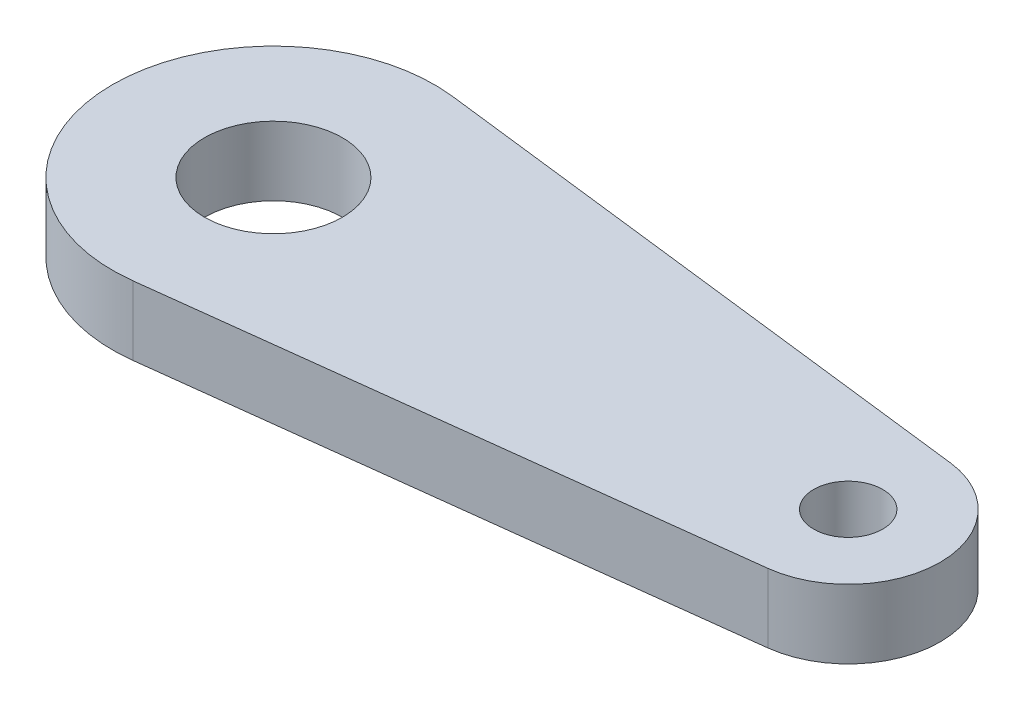
ISO-10303-21;
HEADER;
FILE_DESCRIPTION(('STEP AP214'),'2;1');
FILE_NAME('part.step','',(''),(''),'','','');
FILE_SCHEMA(('AUTOMOTIVE_DESIGN { 1 0 10303 214 1 1 1 1 }'));
ENDSEC;
DATA;
#1=APPLICATION_CONTEXT('core data for automotive mechanical design processes');
#2=APPLICATION_PROTOCOL_DEFINITION('international standard','automotive_design',2000,#1);
#3=PRODUCT_CONTEXT('',#1,'mechanical');
#4=PRODUCT('Part','Part','',(#3));
#5=PRODUCT_RELATED_PRODUCT_CATEGORY('part','',(#4));
#6=PRODUCT_DEFINITION_FORMATION('','',#4);
#7=PRODUCT_DEFINITION_CONTEXT('part definition',#1,'design');
#8=PRODUCT_DEFINITION('design','',#6,#7);
#9=PRODUCT_DEFINITION_SHAPE('','',#8);
#10=(LENGTH_UNIT() NAMED_UNIT(*) SI_UNIT(.MILLI.,.METRE.));
#11=(NAMED_UNIT(*) PLANE_ANGLE_UNIT() SI_UNIT($,.RADIAN.));
#12=(NAMED_UNIT(*) SI_UNIT($,.STERADIAN.) SOLID_ANGLE_UNIT());
#13=UNCERTAINTY_MEASURE_WITH_UNIT(LENGTH_MEASURE(1.E-05),#10,'distance_accuracy_value','');
#14=(GEOMETRIC_REPRESENTATION_CONTEXT(3) GLOBAL_UNCERTAINTY_ASSIGNED_CONTEXT((#13)) GLOBAL_UNIT_ASSIGNED_CONTEXT((#10,
#11,#12)) REPRESENTATION_CONTEXT('',''));
#15=CARTESIAN_POINT('',(0.,0.,0.));
#16=DIRECTION('',(0.,0.,1.));
#17=DIRECTION('',(1.,0.,0.));
#18=AXIS2_PLACEMENT_3D('',#15,#16,#17);
#19=CARTESIAN_POINT('',(25.,3.,0.));
#20=DIRECTION('',(0.,1.,0.));
#21=DIRECTION('',(0.,0.,1.));
#22=AXIS2_PLACEMENT_3D('',#19,#20,#21);
#23=PLANE('',#22);
#24=CARTESIAN_POINT('',(0.,3.,0.));
#25=DIRECTION('',(0.,1.,0.));
#26=DIRECTION('',(0.,0.,1.));
#27=AXIS2_PLACEMENT_3D('',#24,#25,#26);
#28=CIRCLE('',#27,3.);
#29=CARTESIAN_POINT('',(0.,3.,3.));
#30=VERTEX_POINT('',#29);
#31=EDGE_CURVE('E102',#30,#30,#28,.T.);
#32=ORIENTED_EDGE('',*,*,#31,.F.);
#33=EDGE_LOOP('',(#32));
#34=FACE_BOUND('',#33,.T.);
#35=CARTESIAN_POINT('',(25.,3.,0.));
#36=DIRECTION('',(0.,1.,0.));
#37=DIRECTION('',(0.,0.,1.));
#38=AXIS2_PLACEMENT_3D('',#35,#36,#37);
#39=CIRCLE('',#38,4.);
#40=CARTESIAN_POINT('',(25.48,3.,3.97109556671707));
#41=VERTEX_POINT('',#40);
#42=CARTESIAN_POINT('',(25.48,3.,-3.97109556671707));
#43=VERTEX_POINT('',#42);
#44=EDGE_CURVE('E87',#41,#43,#39,.T.);
#45=ORIENTED_EDGE('',*,*,#44,.T.);
#46=DIRECTION('',(-0.992773891679269,0.,-0.12));
#47=VECTOR('',#46,1.);
#48=CARTESIAN_POINT('',(25.48,3.,-3.97109556671707));
#49=LINE('',#48,#47);
#50=CARTESIAN_POINT('',(0.839999999999999,3.,-6.94941724175488));
#51=VERTEX_POINT('',#50);
#52=EDGE_CURVE('E82',#43,#51,#49,.T.);
#53=ORIENTED_EDGE('',*,*,#52,.T.);
#54=CARTESIAN_POINT('',(0.,3.,0.));
#55=DIRECTION('',(0.,1.,0.));
#56=DIRECTION('',(0.,0.,1.));
#57=AXIS2_PLACEMENT_3D('',#54,#55,#56);
#58=CIRCLE('',#57,7.);
#59=CARTESIAN_POINT('',(0.84,3.,6.94941724175488));
#60=VERTEX_POINT('',#59);
#61=EDGE_CURVE('E85',#51,#60,#58,.T.);
#62=ORIENTED_EDGE('',*,*,#61,.T.);
#63=DIRECTION('',(0.992773891679269,0.,-0.12));
#64=VECTOR('',#63,1.);
#65=CARTESIAN_POINT('',(25.48,3.,3.97109556671707));
#66=LINE('',#65,#64);
#67=EDGE_CURVE('E52',#60,#41,#66,.T.);
#68=ORIENTED_EDGE('',*,*,#67,.T.);
#69=EDGE_LOOP('',(#45,#53,#62,#68));
#70=FACE_BOUND('',#69,.T.);
#71=CARTESIAN_POINT('',(25.,3.,0.));
#72=DIRECTION('',(0.,1.,0.));
#73=DIRECTION('',(0.,0.,1.));
#74=AXIS2_PLACEMENT_3D('',#71,#72,#73);
#75=CIRCLE('',#74,1.5);
#76=CARTESIAN_POINT('',(25.,3.,1.5));
#77=VERTEX_POINT('',#76);
#78=EDGE_CURVE('E117',#77,#77,#75,.T.);
#79=ORIENTED_EDGE('',*,*,#78,.F.);
#80=EDGE_LOOP('',(#79));
#81=FACE_BOUND('',#80,.T.);
#82=ADVANCED_FACE('F35',(#34,#70,#81),#23,.T.);
#83=CARTESIAN_POINT('',(25.,0.,0.));
#84=DIRECTION('',(0.,1.,0.));
#85=DIRECTION('',(0.,0.,1.));
#86=AXIS2_PLACEMENT_3D('',#83,#84,#85);
#87=PLANE('',#86);
#88=CARTESIAN_POINT('',(25.,0.,0.));
#89=DIRECTION('',(0.,1.,0.));
#90=DIRECTION('',(0.,0.,1.));
#91=AXIS2_PLACEMENT_3D('',#88,#89,#90);
#92=CIRCLE('',#91,4.);
#93=CARTESIAN_POINT('',(25.48,0.,3.97109556671707));
#94=VERTEX_POINT('',#93);
#95=CARTESIAN_POINT('',(25.48,0.,-3.97109556671707));
#96=VERTEX_POINT('',#95);
#97=EDGE_CURVE('E99',#94,#96,#92,.T.);
#98=ORIENTED_EDGE('',*,*,#97,.F.);
#99=DIRECTION('',(0.992773891679269,0.,-0.12));
#100=VECTOR('',#99,1.);
#101=CARTESIAN_POINT('',(25.48,0.,3.97109556671707));
#102=LINE('',#101,#100);
#103=CARTESIAN_POINT('',(0.84,0.,6.94941724175488));
#104=VERTEX_POINT('',#103);
#105=EDGE_CURVE('E75',#104,#94,#102,.T.);
#106=ORIENTED_EDGE('',*,*,#105,.F.);
#107=CARTESIAN_POINT('',(0.,0.,0.));
#108=DIRECTION('',(0.,1.,0.));
#109=DIRECTION('',(0.,0.,1.));
#110=AXIS2_PLACEMENT_3D('',#107,#108,#109);
#111=CIRCLE('',#110,7.);
#112=CARTESIAN_POINT('',(0.839999999999999,0.,-6.94941724175488));
#113=VERTEX_POINT('',#112);
#114=EDGE_CURVE('E69',#113,#104,#111,.T.);
#115=ORIENTED_EDGE('',*,*,#114,.F.);
#116=DIRECTION('',(-0.992773891679269,0.,-0.12));
#117=VECTOR('',#116,1.);
#118=CARTESIAN_POINT('',(25.48,0.,-3.97109556671707));
#119=LINE('',#118,#117);
#120=EDGE_CURVE('E91',#96,#113,#119,.T.);
#121=ORIENTED_EDGE('',*,*,#120,.F.);
#122=EDGE_LOOP('',(#98,#106,#115,#121));
#123=FACE_BOUND('',#122,.T.);
#124=CARTESIAN_POINT('',(0.,0.,0.));
#125=DIRECTION('',(0.,1.,0.));
#126=DIRECTION('',(0.,0.,1.));
#127=AXIS2_PLACEMENT_3D('',#124,#125,#126);
#128=CIRCLE('',#127,3.);
#129=CARTESIAN_POINT('',(0.,0.,3.));
#130=VERTEX_POINT('',#129);
#131=EDGE_CURVE('E114',#130,#130,#128,.T.);
#132=ORIENTED_EDGE('',*,*,#131,.T.);
#133=EDGE_LOOP('',(#132));
#134=FACE_BOUND('',#133,.T.);
#135=CARTESIAN_POINT('',(25.,0.,0.));
#136=DIRECTION('',(0.,1.,0.));
#137=DIRECTION('',(0.,0.,1.));
#138=AXIS2_PLACEMENT_3D('',#135,#136,#137);
#139=CIRCLE('',#138,1.5);
#140=CARTESIAN_POINT('',(25.,0.,1.5));
#141=VERTEX_POINT('',#140);
#142=EDGE_CURVE('E120',#141,#141,#139,.T.);
#143=ORIENTED_EDGE('',*,*,#142,.T.);
#144=EDGE_LOOP('',(#143));
#145=FACE_BOUND('',#144,.T.);
#146=ADVANCED_FACE('F110',(#123,#134,#145),#87,.F.);
#147=CARTESIAN_POINT('',(25.,3.,0.));
#148=DIRECTION('',(0.,-1.,0.));
#149=DIRECTION('',(0.,0.,-1.));
#150=AXIS2_PLACEMENT_3D('',#147,#148,#149);
#151=CYLINDRICAL_SURFACE('',#150,4.);
#152=ORIENTED_EDGE('',*,*,#97,.T.);
#153=DIRECTION('',(0.,-1.,0.));
#154=VECTOR('',#153,1.);
#155=CARTESIAN_POINT('',(25.48,3.,-3.97109556671707));
#156=LINE('',#155,#154);
#157=EDGE_CURVE('E11',#43,#96,#156,.T.);
#158=ORIENTED_EDGE('',*,*,#157,.F.);
#159=ORIENTED_EDGE('',*,*,#44,.F.);
#160=DIRECTION('',(0.,-1.,0.));
#161=VECTOR('',#160,1.);
#162=CARTESIAN_POINT('',(25.48,3.,3.97109556671707));
#163=LINE('',#162,#161);
#164=EDGE_CURVE('E95',#41,#94,#163,.T.);
#165=ORIENTED_EDGE('',*,*,#164,.T.);
#166=EDGE_LOOP('',(#152,#158,#159,#165));
#167=FACE_BOUND('',#166,.T.);
#168=ADVANCED_FACE('F37',(#167),#151,.T.);
#169=CARTESIAN_POINT('',(25.48,3.,-3.97109556671707));
#170=DIRECTION('',(-0.12,0.,0.992773891679269));
#171=DIRECTION('',(0.992773891679269,0.,0.12));
#172=AXIS2_PLACEMENT_3D('',#169,#170,#171);
#173=PLANE('',#172);
#174=ORIENTED_EDGE('',*,*,#120,.T.);
#175=DIRECTION('',(0.,-1.,0.));
#176=VECTOR('',#175,1.);
#177=CARTESIAN_POINT('',(0.839999999999999,3.,-6.94941724175488));
#178=LINE('',#177,#176);
#179=EDGE_CURVE('E44',#51,#113,#178,.T.);
#180=ORIENTED_EDGE('',*,*,#179,.F.);
#181=ORIENTED_EDGE('',*,*,#52,.F.);
#182=ORIENTED_EDGE('',*,*,#157,.T.);
#183=EDGE_LOOP('',(#174,#180,#181,#182));
#184=FACE_BOUND('',#183,.T.);
#185=ADVANCED_FACE('F90',(#184),#173,.F.);
#186=CARTESIAN_POINT('',(0.,3.,0.));
#187=DIRECTION('',(0.,-1.,0.));
#188=DIRECTION('',(0.,0.,-1.));
#189=AXIS2_PLACEMENT_3D('',#186,#187,#188);
#190=CYLINDRICAL_SURFACE('',#189,7.);
#191=ORIENTED_EDGE('',*,*,#114,.T.);
#192=DIRECTION('',(0.,-1.,0.));
#193=VECTOR('',#192,1.);
#194=CARTESIAN_POINT('',(0.84,3.,6.94941724175488));
#195=LINE('',#194,#193);
#196=EDGE_CURVE('E92',#60,#104,#195,.T.);
#197=ORIENTED_EDGE('',*,*,#196,.F.);
#198=ORIENTED_EDGE('',*,*,#61,.F.);
#199=ORIENTED_EDGE('',*,*,#179,.T.);
#200=EDGE_LOOP('',(#191,#197,#198,#199));
#201=FACE_BOUND('',#200,.T.);
#202=ADVANCED_FACE('F93',(#201),#190,.T.);
#203=CARTESIAN_POINT('',(25.48,3.,3.97109556671707));
#204=DIRECTION('',(-0.12,0.,-0.992773891679269));
#205=DIRECTION('',(-0.992773891679269,0.,0.12));
#206=AXIS2_PLACEMENT_3D('',#203,#204,#205);
#207=PLANE('',#206);
#208=ORIENTED_EDGE('',*,*,#105,.T.);
#209=ORIENTED_EDGE('',*,*,#164,.F.);
#210=ORIENTED_EDGE('',*,*,#67,.F.);
#211=ORIENTED_EDGE('',*,*,#196,.T.);
#212=EDGE_LOOP('',(#208,#209,#210,#211));
#213=FACE_BOUND('',#212,.T.);
#214=ADVANCED_FACE('F107',(#213),#207,.F.);
#215=CARTESIAN_POINT('',(0.,3.,0.));
#216=DIRECTION('',(0.,-1.,0.));
#217=DIRECTION('',(0.,0.,-1.));
#218=AXIS2_PLACEMENT_3D('',#215,#216,#217);
#219=CYLINDRICAL_SURFACE('',#218,3.);
#220=ORIENTED_EDGE('',*,*,#31,.T.);
#221=EDGE_LOOP('',(#220));
#222=FACE_BOUND('',#221,.T.);
#223=ORIENTED_EDGE('',*,*,#131,.F.);
#224=EDGE_LOOP('',(#223));
#225=FACE_BOUND('',#224,.T.);
#226=ADVANCED_FACE('F137',(#222,#225),#219,.F.);
#227=CARTESIAN_POINT('',(25.,3.,0.));
#228=DIRECTION('',(0.,-1.,0.));
#229=DIRECTION('',(0.,0.,-1.));
#230=AXIS2_PLACEMENT_3D('',#227,#228,#229);
#231=CYLINDRICAL_SURFACE('',#230,1.5);
#232=ORIENTED_EDGE('',*,*,#78,.T.);
#233=EDGE_LOOP('',(#232));
#234=FACE_BOUND('',#233,.T.);
#235=ORIENTED_EDGE('',*,*,#142,.F.);
#236=EDGE_LOOP('',(#235));
#237=FACE_BOUND('',#236,.T.);
#238=ADVANCED_FACE('F126',(#234,#237),#231,.F.);
#239=CLOSED_SHELL('',(#82,#146,#168,#185,#202,#214,#226,#238));
#240=MANIFOLD_SOLID_BREP('B2',#239);
#241=ADVANCED_BREP_SHAPE_REPRESENTATION('',(#18,#240),#14);
#242=SHAPE_DEFINITION_REPRESENTATION(#9,#241);
ENDSEC;
END-ISO-10303-21;
